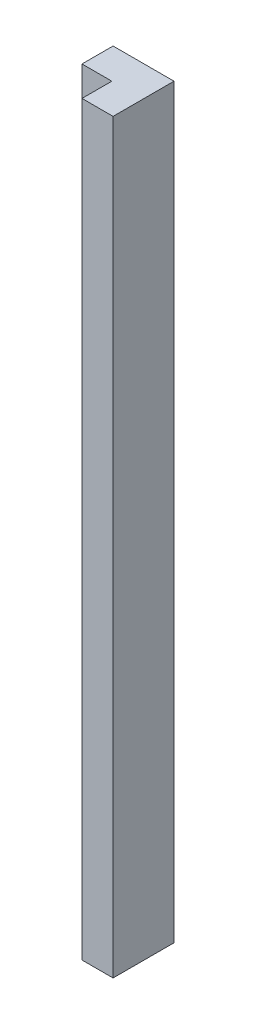
ISO-10303-21;
HEADER;
FILE_DESCRIPTION(('STEP AP214'),'2;1');
FILE_NAME('part.step','',(''),(''),'','','');
FILE_SCHEMA(('AUTOMOTIVE_DESIGN { 1 0 10303 214 1 1 1 1 }'));
ENDSEC;
DATA;
#1=APPLICATION_CONTEXT('core data for automotive mechanical design processes');
#2=APPLICATION_PROTOCOL_DEFINITION('international standard','automotive_design',2000,#1);
#3=PRODUCT_CONTEXT('',#1,'mechanical');
#4=PRODUCT('Part','Part','',(#3));
#5=PRODUCT_RELATED_PRODUCT_CATEGORY('part','',(#4));
#6=PRODUCT_DEFINITION_FORMATION('','',#4);
#7=PRODUCT_DEFINITION_CONTEXT('part definition',#1,'design');
#8=PRODUCT_DEFINITION('design','',#6,#7);
#9=PRODUCT_DEFINITION_SHAPE('','',#8);
#10=(LENGTH_UNIT() NAMED_UNIT(*) SI_UNIT(.MILLI.,.METRE.));
#11=(NAMED_UNIT(*) PLANE_ANGLE_UNIT() SI_UNIT($,.RADIAN.));
#12=(NAMED_UNIT(*) SI_UNIT($,.STERADIAN.) SOLID_ANGLE_UNIT());
#13=UNCERTAINTY_MEASURE_WITH_UNIT(LENGTH_MEASURE(1.E-05),#10,'distance_accuracy_value','');
#14=(GEOMETRIC_REPRESENTATION_CONTEXT(3) GLOBAL_UNCERTAINTY_ASSIGNED_CONTEXT((#13)) GLOBAL_UNIT_ASSIGNED_CONTEXT((#10,
#11,#12)) REPRESENTATION_CONTEXT('',''));
#15=CARTESIAN_POINT('',(0.,0.,0.));
#16=DIRECTION('',(0.,0.,1.));
#17=DIRECTION('',(1.,0.,0.));
#18=AXIS2_PLACEMENT_3D('',#15,#16,#17);
#19=CARTESIAN_POINT('',(0.,0.,5.));
#20=DIRECTION('',(0.,0.,-1.));
#21=DIRECTION('',(-1.,0.,0.));
#22=AXIS2_PLACEMENT_3D('',#19,#20,#21);
#23=PLANE('',#22);
#24=DIRECTION('',(0.,-1.,0.));
#25=VECTOR('',#24,1.);
#26=CARTESIAN_POINT('',(4.8,0.,5.));
#27=LINE('',#26,#25);
#28=CARTESIAN_POINT('',(4.8,120.,5.));
#29=VERTEX_POINT('',#28);
#30=CARTESIAN_POINT('',(4.8,0.,5.));
#31=VERTEX_POINT('',#30);
#32=EDGE_CURVE('E55',#29,#31,#27,.T.);
#33=ORIENTED_EDGE('',*,*,#32,.F.);
#34=DIRECTION('',(-1.,0.,0.));
#35=VECTOR('',#34,1.);
#36=CARTESIAN_POINT('',(0.,120.,5.));
#37=LINE('',#36,#35);
#38=CARTESIAN_POINT('',(0.,120.,5.));
#39=VERTEX_POINT('',#38);
#40=EDGE_CURVE('E60',#29,#39,#37,.T.);
#41=ORIENTED_EDGE('',*,*,#40,.T.);
#42=DIRECTION('',(0.,-1.,0.));
#43=VECTOR('',#42,1.);
#44=CARTESIAN_POINT('',(0.,0.,5.));
#45=LINE('',#44,#43);
#46=CARTESIAN_POINT('',(0.,0.,5.));
#47=VERTEX_POINT('',#46);
#48=EDGE_CURVE('E92',#39,#47,#45,.T.);
#49=ORIENTED_EDGE('',*,*,#48,.T.);
#50=DIRECTION('',(1.,0.,0.));
#51=VECTOR('',#50,1.);
#52=CARTESIAN_POINT('',(0.,0.,5.));
#53=LINE('',#52,#51);
#54=EDGE_CURVE('E154',#47,#31,#53,.T.);
#55=ORIENTED_EDGE('',*,*,#54,.T.);
#56=EDGE_LOOP('',(#33,#41,#49,#55));
#57=FACE_BOUND('',#56,.T.);
#58=ADVANCED_FACE('F39',(#57),#23,.F.);
#59=CARTESIAN_POINT('',(0.,0.,5.));
#60=DIRECTION('',(1.,0.,0.));
#61=DIRECTION('',(0.,0.,-1.));
#62=AXIS2_PLACEMENT_3D('',#59,#60,#61);
#63=PLANE('',#62);
#64=DIRECTION('',(0.,-1.,0.));
#65=VECTOR('',#64,1.);
#66=CARTESIAN_POINT('',(0.,0.,0.));
#67=LINE('',#66,#65);
#68=CARTESIAN_POINT('',(0.,120.,0.));
#69=VERTEX_POINT('',#68);
#70=CARTESIAN_POINT('',(0.,0.,0.));
#71=VERTEX_POINT('',#70);
#72=EDGE_CURVE('E98',#69,#71,#67,.T.);
#73=ORIENTED_EDGE('',*,*,#72,.T.);
#74=DIRECTION('',(0.,0.,-1.));
#75=VECTOR('',#74,1.);
#76=CARTESIAN_POINT('',(0.,0.,5.));
#77=LINE('',#76,#75);
#78=EDGE_CURVE('E11',#47,#71,#77,.T.);
#79=ORIENTED_EDGE('',*,*,#78,.F.);
#80=ORIENTED_EDGE('',*,*,#48,.F.);
#81=DIRECTION('',(0.,0.,-1.));
#82=VECTOR('',#81,1.);
#83=CARTESIAN_POINT('',(0.,120.,5.));
#84=LINE('',#83,#82);
#85=EDGE_CURVE('E83',#39,#69,#84,.T.);
#86=ORIENTED_EDGE('',*,*,#85,.T.);
#87=EDGE_LOOP('',(#73,#79,#80,#86));
#88=FACE_BOUND('',#87,.T.);
#89=ADVANCED_FACE('F41',(#88),#63,.F.);
#90=CARTESIAN_POINT('',(0.,0.,5.));
#91=DIRECTION('',(0.,1.,0.));
#92=DIRECTION('',(0.,0.,1.));
#93=AXIS2_PLACEMENT_3D('',#90,#91,#92);
#94=PLANE('',#93);
#95=DIRECTION('',(1.,0.,0.));
#96=VECTOR('',#95,1.);
#97=CARTESIAN_POINT('',(0.,0.,0.));
#98=LINE('',#97,#96);
#99=CARTESIAN_POINT('',(9.8,0.,0.));
#100=VERTEX_POINT('',#99);
#101=EDGE_CURVE('E102',#71,#100,#98,.T.);
#102=ORIENTED_EDGE('',*,*,#101,.T.);
#103=DIRECTION('',(0.,0.,-1.));
#104=VECTOR('',#103,1.);
#105=CARTESIAN_POINT('',(9.8,0.,5.));
#106=LINE('',#105,#104);
#107=CARTESIAN_POINT('',(9.8,0.,9.8));
#108=VERTEX_POINT('',#107);
#109=EDGE_CURVE('E48',#108,#100,#106,.T.);
#110=ORIENTED_EDGE('',*,*,#109,.F.);
#111=DIRECTION('',(1.,0.,0.));
#112=VECTOR('',#111,1.);
#113=CARTESIAN_POINT('',(9.8,0.,9.8));
#114=LINE('',#113,#112);
#115=CARTESIAN_POINT('',(4.8,0.,9.8));
#116=VERTEX_POINT('',#115);
#117=EDGE_CURVE('E132',#116,#108,#114,.T.);
#118=ORIENTED_EDGE('',*,*,#117,.F.);
#119=DIRECTION('',(0.,0.,-1.));
#120=VECTOR('',#119,1.);
#121=CARTESIAN_POINT('',(4.8,0.,9.8));
#122=LINE('',#121,#120);
#123=EDGE_CURVE('E110',#116,#31,#122,.T.);
#124=ORIENTED_EDGE('',*,*,#123,.T.);
#125=ORIENTED_EDGE('',*,*,#54,.F.);
#126=ORIENTED_EDGE('',*,*,#78,.T.);
#127=EDGE_LOOP('',(#102,#110,#118,#124,#125,#126));
#128=FACE_BOUND('',#127,.T.);
#129=ADVANCED_FACE('F129',(#128),#94,.F.);
#130=CARTESIAN_POINT('',(9.8,0.,5.));
#131=DIRECTION('',(-1.,0.,0.));
#132=DIRECTION('',(0.,0.,1.));
#133=AXIS2_PLACEMENT_3D('',#130,#131,#132);
#134=PLANE('',#133);
#135=DIRECTION('',(0.,1.,0.));
#136=VECTOR('',#135,1.);
#137=CARTESIAN_POINT('',(9.8,0.,0.));
#138=LINE('',#137,#136);
#139=CARTESIAN_POINT('',(9.8,120.,0.));
#140=VERTEX_POINT('',#139);
#141=EDGE_CURVE('E93',#100,#140,#138,.T.);
#142=ORIENTED_EDGE('',*,*,#141,.T.);
#143=DIRECTION('',(0.,0.,-1.));
#144=VECTOR('',#143,1.);
#145=CARTESIAN_POINT('',(9.8,120.,5.));
#146=LINE('',#145,#144);
#147=CARTESIAN_POINT('',(9.8,120.,9.8));
#148=VERTEX_POINT('',#147);
#149=EDGE_CURVE('E87',#148,#140,#146,.T.);
#150=ORIENTED_EDGE('',*,*,#149,.F.);
#151=DIRECTION('',(0.,1.,0.));
#152=VECTOR('',#151,1.);
#153=CARTESIAN_POINT('',(9.8,0.,9.8));
#154=LINE('',#153,#152);
#155=EDGE_CURVE('E125',#108,#148,#154,.T.);
#156=ORIENTED_EDGE('',*,*,#155,.F.);
#157=ORIENTED_EDGE('',*,*,#109,.T.);
#158=EDGE_LOOP('',(#142,#150,#156,#157));
#159=FACE_BOUND('',#158,.T.);
#160=ADVANCED_FACE('F123',(#159),#134,.F.);
#161=CARTESIAN_POINT('',(0.,120.,5.));
#162=DIRECTION('',(0.,-1.,0.));
#163=DIRECTION('',(0.,0.,-1.));
#164=AXIS2_PLACEMENT_3D('',#161,#162,#163);
#165=PLANE('',#164);
#166=DIRECTION('',(-1.,0.,0.));
#167=VECTOR('',#166,1.);
#168=CARTESIAN_POINT('',(0.,120.,0.));
#169=LINE('',#168,#167);
#170=EDGE_CURVE('E80',#140,#69,#169,.T.);
#171=ORIENTED_EDGE('',*,*,#170,.T.);
#172=ORIENTED_EDGE('',*,*,#85,.F.);
#173=ORIENTED_EDGE('',*,*,#40,.F.);
#174=DIRECTION('',(0.,0.,-1.));
#175=VECTOR('',#174,1.);
#176=CARTESIAN_POINT('',(4.8,120.,9.8));
#177=LINE('',#176,#175);
#178=CARTESIAN_POINT('',(4.8,120.,9.8));
#179=VERTEX_POINT('',#178);
#180=EDGE_CURVE('E104',#179,#29,#177,.T.);
#181=ORIENTED_EDGE('',*,*,#180,.F.);
#182=DIRECTION('',(-1.,0.,0.));
#183=VECTOR('',#182,1.);
#184=CARTESIAN_POINT('',(9.8,120.,9.8));
#185=LINE('',#184,#183);
#186=EDGE_CURVE('E147',#148,#179,#185,.T.);
#187=ORIENTED_EDGE('',*,*,#186,.F.);
#188=ORIENTED_EDGE('',*,*,#149,.T.);
#189=EDGE_LOOP('',(#171,#172,#173,#181,#187,#188));
#190=FACE_BOUND('',#189,.T.);
#191=ADVANCED_FACE('F82',(#190),#165,.F.);
#192=CARTESIAN_POINT('',(0.,0.,0.));
#193=DIRECTION('',(0.,0.,-1.));
#194=DIRECTION('',(-1.,0.,0.));
#195=AXIS2_PLACEMENT_3D('',#192,#193,#194);
#196=PLANE('',#195);
#197=ORIENTED_EDGE('',*,*,#72,.F.);
#198=ORIENTED_EDGE('',*,*,#170,.F.);
#199=ORIENTED_EDGE('',*,*,#141,.F.);
#200=ORIENTED_EDGE('',*,*,#101,.F.);
#201=EDGE_LOOP('',(#197,#198,#199,#200));
#202=FACE_BOUND('',#201,.T.);
#203=ADVANCED_FACE('F101',(#202),#196,.T.);
#204=CARTESIAN_POINT('',(4.8,0.,9.8));
#205=DIRECTION('',(1.,0.,0.));
#206=DIRECTION('',(0.,0.,-1.));
#207=AXIS2_PLACEMENT_3D('',#204,#205,#206);
#208=PLANE('',#207);
#209=ORIENTED_EDGE('',*,*,#32,.T.);
#210=ORIENTED_EDGE('',*,*,#123,.F.);
#211=DIRECTION('',(0.,-1.,0.));
#212=VECTOR('',#211,1.);
#213=CARTESIAN_POINT('',(4.8,0.,9.8));
#214=LINE('',#213,#212);
#215=EDGE_CURVE('E140',#179,#116,#214,.T.);
#216=ORIENTED_EDGE('',*,*,#215,.F.);
#217=ORIENTED_EDGE('',*,*,#180,.T.);
#218=EDGE_LOOP('',(#209,#210,#216,#217));
#219=FACE_BOUND('',#218,.T.);
#220=ADVANCED_FACE('F159',(#219),#208,.F.);
#221=CARTESIAN_POINT('',(0.,0.,9.8));
#222=DIRECTION('',(0.,0.,1.));
#223=DIRECTION('',(1.,0.,0.));
#224=AXIS2_PLACEMENT_3D('',#221,#222,#223);
#225=PLANE('',#224);
#226=ORIENTED_EDGE('',*,*,#155,.T.);
#227=ORIENTED_EDGE('',*,*,#186,.T.);
#228=ORIENTED_EDGE('',*,*,#215,.T.);
#229=ORIENTED_EDGE('',*,*,#117,.T.);
#230=EDGE_LOOP('',(#226,#227,#228,#229));
#231=FACE_BOUND('',#230,.T.);
#232=ADVANCED_FACE('F136',(#231),#225,.T.);
#233=CLOSED_SHELL('',(#58,#89,#129,#160,#191,#203,#220,#232));
#234=MANIFOLD_SOLID_BREP('B2',#233);
#235=ADVANCED_BREP_SHAPE_REPRESENTATION('',(#18,#234),#14);
#236=SHAPE_DEFINITION_REPRESENTATION(#9,#235);
ENDSEC;
END-ISO-10303-21;
